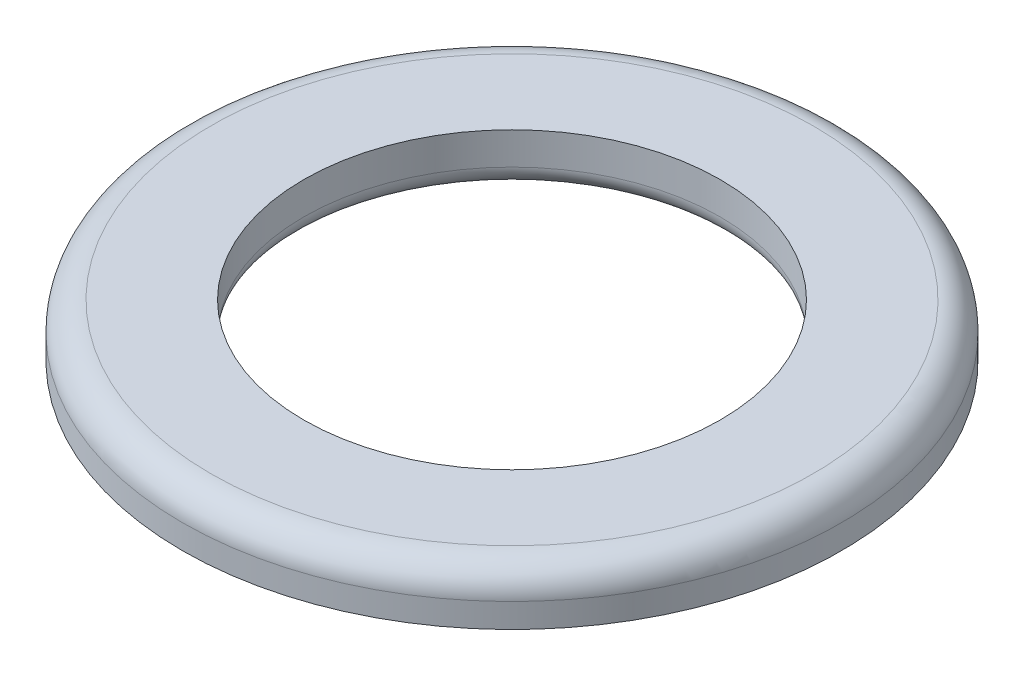
ISO-10303-21;
HEADER;
FILE_DESCRIPTION(('STEP AP214'),'2;1');
FILE_NAME('part.step','',(''),(''),'','','');
FILE_SCHEMA(('AUTOMOTIVE_DESIGN { 1 0 10303 214 1 1 1 1 }'));
ENDSEC;
DATA;
#1=APPLICATION_CONTEXT('core data for automotive mechanical design processes');
#2=APPLICATION_PROTOCOL_DEFINITION('international standard','automotive_design',2000,#1);
#3=PRODUCT_CONTEXT('',#1,'mechanical');
#4=PRODUCT('Part','Part','',(#3));
#5=PRODUCT_RELATED_PRODUCT_CATEGORY('part','',(#4));
#6=PRODUCT_DEFINITION_FORMATION('','',#4);
#7=PRODUCT_DEFINITION_CONTEXT('part definition',#1,'design');
#8=PRODUCT_DEFINITION('design','',#6,#7);
#9=PRODUCT_DEFINITION_SHAPE('','',#8);
#10=(LENGTH_UNIT() NAMED_UNIT(*) SI_UNIT(.MILLI.,.METRE.));
#11=(NAMED_UNIT(*) PLANE_ANGLE_UNIT() SI_UNIT($,.RADIAN.));
#12=(NAMED_UNIT(*) SI_UNIT($,.STERADIAN.) SOLID_ANGLE_UNIT());
#13=UNCERTAINTY_MEASURE_WITH_UNIT(LENGTH_MEASURE(1.E-05),#10,'distance_accuracy_value','');
#14=(GEOMETRIC_REPRESENTATION_CONTEXT(3) GLOBAL_UNCERTAINTY_ASSIGNED_CONTEXT((#13)) GLOBAL_UNIT_ASSIGNED_CONTEXT((#10,
#11,#12)) REPRESENTATION_CONTEXT('',''));
#15=CARTESIAN_POINT('',(0.,0.,0.));
#16=DIRECTION('',(0.,0.,1.));
#17=DIRECTION('',(1.,0.,0.));
#18=AXIS2_PLACEMENT_3D('',#15,#16,#17);
#19=CARTESIAN_POINT('',(0.,1.3,0.));
#20=DIRECTION('',(0.,1.,0.));
#21=DIRECTION('',(0.,0.,1.));
#22=AXIS2_PLACEMENT_3D('',#19,#20,#21);
#23=PLANE('',#22);
#24=CARTESIAN_POINT('',(0.,1.3,0.));
#25=DIRECTION('',(0.,1.,0.));
#26=DIRECTION('',(0.,0.,1.));
#27=AXIS2_PLACEMENT_3D('',#24,#25,#26);
#28=CIRCLE('',#27,7.45);
#29=CARTESIAN_POINT('',(0.,1.3,7.45));
#30=VERTEX_POINT('',#29);
#31=EDGE_CURVE('E49',#30,#30,#28,.T.);
#32=ORIENTED_EDGE('',*,*,#31,.T.);
#33=EDGE_LOOP('',(#32));
#34=FACE_BOUND('',#33,.T.);
#35=CARTESIAN_POINT('',(0.,1.3,0.));
#36=DIRECTION('',(0.,1.,0.));
#37=DIRECTION('',(0.,0.,1.));
#38=AXIS2_PLACEMENT_3D('',#35,#36,#37);
#39=CIRCLE('',#38,5.15);
#40=CARTESIAN_POINT('',(0.,1.3,5.15));
#41=VERTEX_POINT('',#40);
#42=EDGE_CURVE('E57',#41,#41,#39,.T.);
#43=ORIENTED_EDGE('',*,*,#42,.F.);
#44=EDGE_LOOP('',(#43));
#45=FACE_BOUND('',#44,.T.);
#46=ADVANCED_FACE('F34',(#34,#45),#23,.T.);
#47=CARTESIAN_POINT('',(0.,0.,0.));
#48=DIRECTION('',(0.,1.,0.));
#49=DIRECTION('',(0.,0.,1.));
#50=AXIS2_PLACEMENT_3D('',#47,#48,#49);
#51=PLANE('',#50);
#52=CARTESIAN_POINT('',(0.,0.,0.));
#53=DIRECTION('',(0.,1.,0.));
#54=DIRECTION('',(0.,0.,1.));
#55=AXIS2_PLACEMENT_3D('',#52,#53,#54);
#56=CIRCLE('',#55,5.65);
#57=CARTESIAN_POINT('',(0.,0.,5.65));
#58=VERTEX_POINT('',#57);
#59=EDGE_CURVE('E41',#58,#58,#56,.T.);
#60=ORIENTED_EDGE('',*,*,#59,.T.);
#61=EDGE_LOOP('',(#60));
#62=FACE_BOUND('',#61,.T.);
#63=CARTESIAN_POINT('',(0.,0.,0.));
#64=DIRECTION('',(0.,1.,0.));
#65=DIRECTION('',(0.,0.,1.));
#66=AXIS2_PLACEMENT_3D('',#63,#64,#65);
#67=CIRCLE('',#66,8.15);
#68=CARTESIAN_POINT('',(0.,0.,8.15));
#69=VERTEX_POINT('',#68);
#70=EDGE_CURVE('E54',#69,#69,#67,.T.);
#71=ORIENTED_EDGE('',*,*,#70,.F.);
#72=EDGE_LOOP('',(#71));
#73=FACE_BOUND('',#72,.T.);
#74=ADVANCED_FACE('F64',(#62,#73),#51,.F.);
#75=CARTESIAN_POINT('',(0.,1.3,0.));
#76=DIRECTION('',(0.,-1.,0.));
#77=DIRECTION('',(0.,0.,-1.));
#78=AXIS2_PLACEMENT_3D('',#75,#76,#77);
#79=CYLINDRICAL_SURFACE('',#78,8.15);
#80=CARTESIAN_POINT('',(0.,0.6,0.));
#81=DIRECTION('',(0.,1.,0.));
#82=DIRECTION('',(0.,0.,1.));
#83=AXIS2_PLACEMENT_3D('',#80,#81,#82);
#84=CIRCLE('',#83,8.15);
#85=CARTESIAN_POINT('',(0.,0.6,8.15));
#86=VERTEX_POINT('',#85);
#87=EDGE_CURVE('E45',#86,#86,#84,.F.);
#88=ORIENTED_EDGE('',*,*,#87,.T.);
#89=EDGE_LOOP('',(#88));
#90=FACE_BOUND('',#89,.T.);
#91=ORIENTED_EDGE('',*,*,#70,.T.);
#92=EDGE_LOOP('',(#91));
#93=FACE_BOUND('',#92,.T.);
#94=ADVANCED_FACE('F70',(#90,#93),#79,.T.);
#95=CARTESIAN_POINT('',(0.,1.3,0.));
#96=DIRECTION('',(0.,-1.,0.));
#97=DIRECTION('',(0.,0.,-1.));
#98=AXIS2_PLACEMENT_3D('',#95,#96,#97);
#99=CYLINDRICAL_SURFACE('',#98,5.15);
#100=CARTESIAN_POINT('',(0.,0.5,0.));
#101=DIRECTION('',(0.,1.,0.));
#102=DIRECTION('',(0.,0.,1.));
#103=AXIS2_PLACEMENT_3D('',#100,#101,#102);
#104=CIRCLE('',#103,5.15);
#105=CARTESIAN_POINT('',(0.,0.5,5.15));
#106=VERTEX_POINT('',#105);
#107=EDGE_CURVE('E10',#106,#106,#104,.F.);
#108=ORIENTED_EDGE('',*,*,#107,.T.);
#109=EDGE_LOOP('',(#108));
#110=FACE_BOUND('',#109,.T.);
#111=ORIENTED_EDGE('',*,*,#42,.T.);
#112=EDGE_LOOP('',(#111));
#113=FACE_BOUND('',#112,.T.);
#114=ADVANCED_FACE('F61',(#110,#113),#99,.F.);
#115=CARTESIAN_POINT('',(0.,0.6,0.));
#116=DIRECTION('',(0.,1.,0.));
#117=DIRECTION('',(0.,0.,1.));
#118=AXIS2_PLACEMENT_3D('',#115,#116,#117);
#119=TOROIDAL_SURFACE('',#118,7.45,0.7);
#120=ORIENTED_EDGE('',*,*,#87,.F.);
#121=EDGE_LOOP('',(#120));
#122=FACE_BOUND('',#121,.T.);
#123=ORIENTED_EDGE('',*,*,#31,.F.);
#124=EDGE_LOOP('',(#123));
#125=FACE_BOUND('',#124,.T.);
#126=ADVANCED_FACE('F76',(#122,#125),#119,.T.);
#127=CARTESIAN_POINT('',(0.,0.5,0.));
#128=DIRECTION('',(0.,1.,0.));
#129=DIRECTION('',(0.,0.,1.));
#130=AXIS2_PLACEMENT_3D('',#127,#128,#129);
#131=TOROIDAL_SURFACE('',#130,5.65,0.5);
#132=ORIENTED_EDGE('',*,*,#107,.F.);
#133=EDGE_LOOP('',(#132));
#134=FACE_BOUND('',#133,.T.);
#135=ORIENTED_EDGE('',*,*,#59,.F.);
#136=EDGE_LOOP('',(#135));
#137=FACE_BOUND('',#136,.T.);
#138=ADVANCED_FACE('F36',(#134,#137),#131,.T.);
#139=CLOSED_SHELL('',(#46,#74,#94,#114,#126,#138));
#140=MANIFOLD_SOLID_BREP('B2',#139);
#141=ADVANCED_BREP_SHAPE_REPRESENTATION('',(#18,#140),#14);
#142=SHAPE_DEFINITION_REPRESENTATION(#9,#141);
ENDSEC;
END-ISO-10303-21;
